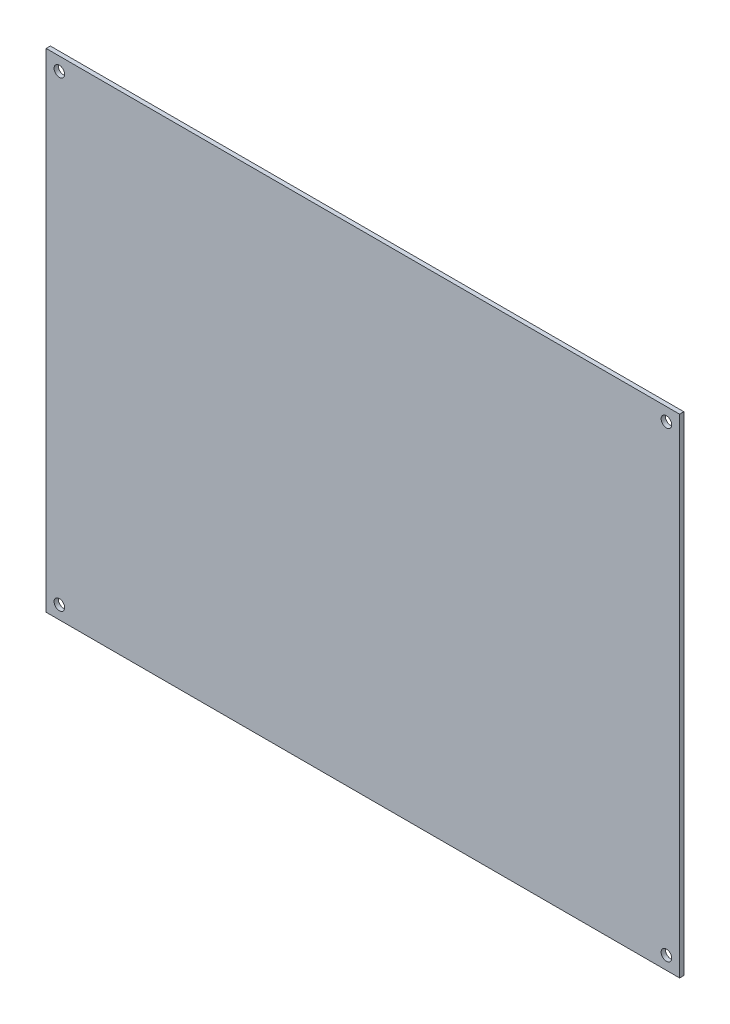
ISO-10303-21;
HEADER;
FILE_DESCRIPTION(('STEP AP214'),'2;1');
FILE_NAME('part.step','',(''),(''),'','','');
FILE_SCHEMA(('AUTOMOTIVE_DESIGN { 1 0 10303 214 1 1 1 1 }'));
ENDSEC;
DATA;
#1=APPLICATION_CONTEXT('core data for automotive mechanical design processes');
#2=APPLICATION_PROTOCOL_DEFINITION('international standard','automotive_design',2000,#1);
#3=PRODUCT_CONTEXT('',#1,'mechanical');
#4=PRODUCT('Part','Part','',(#3));
#5=PRODUCT_RELATED_PRODUCT_CATEGORY('part','',(#4));
#6=PRODUCT_DEFINITION_FORMATION('','',#4);
#7=PRODUCT_DEFINITION_CONTEXT('part definition',#1,'design');
#8=PRODUCT_DEFINITION('design','',#6,#7);
#9=PRODUCT_DEFINITION_SHAPE('','',#8);
#10=(LENGTH_UNIT() NAMED_UNIT(*) SI_UNIT(.MILLI.,.METRE.));
#11=(NAMED_UNIT(*) PLANE_ANGLE_UNIT() SI_UNIT($,.RADIAN.));
#12=(NAMED_UNIT(*) SI_UNIT($,.STERADIAN.) SOLID_ANGLE_UNIT());
#13=UNCERTAINTY_MEASURE_WITH_UNIT(LENGTH_MEASURE(1.E-05),#10,'distance_accuracy_value','');
#14=(GEOMETRIC_REPRESENTATION_CONTEXT(3) GLOBAL_UNCERTAINTY_ASSIGNED_CONTEXT((#13)) GLOBAL_UNIT_ASSIGNED_CONTEXT((#10,
#11,#12)) REPRESENTATION_CONTEXT('',''));
#15=CARTESIAN_POINT('',(0.,0.,0.));
#16=DIRECTION('',(0.,0.,1.));
#17=DIRECTION('',(1.,0.,0.));
#18=AXIS2_PLACEMENT_3D('',#15,#16,#17);
#19=CARTESIAN_POINT('',(0.,0.,1.6));
#20=DIRECTION('',(0.,0.,-1.));
#21=DIRECTION('',(-1.,0.,0.));
#22=AXIS2_PLACEMENT_3D('',#19,#20,#21);
#23=PLANE('',#22);
#24=DIRECTION('',(0.,1.,0.));
#25=VECTOR('',#24,1.);
#26=CARTESIAN_POINT('',(120.,-92.5,1.6));
#27=LINE('',#26,#25);
#28=CARTESIAN_POINT('',(120.,-92.5,1.6));
#29=VERTEX_POINT('',#28);
#30=CARTESIAN_POINT('',(120.,92.5,1.6));
#31=VERTEX_POINT('',#30);
#32=EDGE_CURVE('E85',#29,#31,#27,.T.);
#33=ORIENTED_EDGE('',*,*,#32,.T.);
#34=DIRECTION('',(-1.,0.,0.));
#35=VECTOR('',#34,1.);
#36=CARTESIAN_POINT('',(-120.,92.5,1.6));
#37=LINE('',#36,#35);
#38=CARTESIAN_POINT('',(-120.,92.5,1.6));
#39=VERTEX_POINT('',#38);
#40=EDGE_CURVE('E80',#31,#39,#37,.T.);
#41=ORIENTED_EDGE('',*,*,#40,.T.);
#42=DIRECTION('',(0.,-1.,0.));
#43=VECTOR('',#42,1.);
#44=CARTESIAN_POINT('',(-120.,-92.5,1.6));
#45=LINE('',#44,#43);
#46=CARTESIAN_POINT('',(-120.,-92.5,1.6));
#47=VERTEX_POINT('',#46);
#48=EDGE_CURVE('E83',#39,#47,#45,.T.);
#49=ORIENTED_EDGE('',*,*,#48,.T.);
#50=DIRECTION('',(1.,0.,0.));
#51=VECTOR('',#50,1.);
#52=CARTESIAN_POINT('',(-120.,-92.5,1.6));
#53=LINE('',#52,#51);
#54=EDGE_CURVE('E50',#47,#29,#53,.T.);
#55=ORIENTED_EDGE('',*,*,#54,.T.);
#56=EDGE_LOOP('',(#33,#41,#49,#55));
#57=FACE_BOUND('',#56,.T.);
#58=CARTESIAN_POINT('',(115.,87.5,1.6));
#59=DIRECTION('',(0.,0.,1.));
#60=DIRECTION('',(1.,0.,0.));
#61=AXIS2_PLACEMENT_3D('',#58,#59,#60);
#62=CIRCLE('',#61,2.);
#63=CARTESIAN_POINT('',(117.,87.5,1.6));
#64=VERTEX_POINT('',#63);
#65=EDGE_CURVE('E100',#64,#64,#62,.T.);
#66=ORIENTED_EDGE('',*,*,#65,.F.);
#67=EDGE_LOOP('',(#66));
#68=FACE_BOUND('',#67,.T.);
#69=CARTESIAN_POINT('',(115.,-87.5,1.6));
#70=DIRECTION('',(0.,0.,1.));
#71=DIRECTION('',(-1.,0.,0.));
#72=AXIS2_PLACEMENT_3D('',#69,#70,#71);
#73=CIRCLE('',#72,2.);
#74=CARTESIAN_POINT('',(113.,-87.5,1.6));
#75=VERTEX_POINT('',#74);
#76=EDGE_CURVE('E115',#75,#75,#73,.T.);
#77=ORIENTED_EDGE('',*,*,#76,.F.);
#78=EDGE_LOOP('',(#77));
#79=FACE_BOUND('',#78,.T.);
#80=CARTESIAN_POINT('',(-115.,-87.5,1.6));
#81=DIRECTION('',(0.,0.,1.));
#82=DIRECTION('',(1.,0.,0.));
#83=AXIS2_PLACEMENT_3D('',#80,#81,#82);
#84=CIRCLE('',#83,2.);
#85=CARTESIAN_POINT('',(-113.,-87.5,1.6));
#86=VERTEX_POINT('',#85);
#87=EDGE_CURVE('E121',#86,#86,#84,.T.);
#88=ORIENTED_EDGE('',*,*,#87,.F.);
#89=EDGE_LOOP('',(#88));
#90=FACE_BOUND('',#89,.T.);
#91=CARTESIAN_POINT('',(-115.,87.5,1.6));
#92=DIRECTION('',(0.,0.,1.));
#93=DIRECTION('',(-1.,0.,0.));
#94=AXIS2_PLACEMENT_3D('',#91,#92,#93);
#95=CIRCLE('',#94,2.);
#96=CARTESIAN_POINT('',(-117.,87.5,1.6));
#97=VERTEX_POINT('',#96);
#98=EDGE_CURVE('E127',#97,#97,#95,.T.);
#99=ORIENTED_EDGE('',*,*,#98,.F.);
#100=EDGE_LOOP('',(#99));
#101=FACE_BOUND('',#100,.T.);
#102=ADVANCED_FACE('F33',(#57,#68,#79,#90,#101),#23,.F.);
#103=CARTESIAN_POINT('',(0.,0.,0.));
#104=DIRECTION('',(0.,0.,-1.));
#105=DIRECTION('',(-1.,0.,0.));
#106=AXIS2_PLACEMENT_3D('',#103,#104,#105);
#107=PLANE('',#106);
#108=CARTESIAN_POINT('',(-115.,-87.5,0.));
#109=DIRECTION('',(0.,0.,1.));
#110=DIRECTION('',(1.,0.,0.));
#111=AXIS2_PLACEMENT_3D('',#108,#109,#110);
#112=CIRCLE('',#111,2.);
#113=CARTESIAN_POINT('',(-113.,-87.5,0.));
#114=VERTEX_POINT('',#113);
#115=EDGE_CURVE('E124',#114,#114,#112,.T.);
#116=ORIENTED_EDGE('',*,*,#115,.T.);
#117=EDGE_LOOP('',(#116));
#118=FACE_BOUND('',#117,.T.);
#119=CARTESIAN_POINT('',(115.,87.5,0.));
#120=DIRECTION('',(0.,0.,1.));
#121=DIRECTION('',(1.,0.,0.));
#122=AXIS2_PLACEMENT_3D('',#119,#120,#121);
#123=CIRCLE('',#122,2.);
#124=CARTESIAN_POINT('',(117.,87.5,0.));
#125=VERTEX_POINT('',#124);
#126=EDGE_CURVE('E112',#125,#125,#123,.T.);
#127=ORIENTED_EDGE('',*,*,#126,.T.);
#128=EDGE_LOOP('',(#127));
#129=FACE_BOUND('',#128,.T.);
#130=DIRECTION('',(0.,1.,0.));
#131=VECTOR('',#130,1.);
#132=CARTESIAN_POINT('',(120.,-92.5,0.));
#133=LINE('',#132,#131);
#134=CARTESIAN_POINT('',(120.,-92.5,0.));
#135=VERTEX_POINT('',#134);
#136=CARTESIAN_POINT('',(120.,92.5,0.));
#137=VERTEX_POINT('',#136);
#138=EDGE_CURVE('E97',#135,#137,#133,.T.);
#139=ORIENTED_EDGE('',*,*,#138,.F.);
#140=DIRECTION('',(1.,0.,0.));
#141=VECTOR('',#140,1.);
#142=CARTESIAN_POINT('',(-120.,-92.5,0.));
#143=LINE('',#142,#141);
#144=CARTESIAN_POINT('',(-120.,-92.5,0.));
#145=VERTEX_POINT('',#144);
#146=EDGE_CURVE('E73',#145,#135,#143,.T.);
#147=ORIENTED_EDGE('',*,*,#146,.F.);
#148=DIRECTION('',(0.,-1.,0.));
#149=VECTOR('',#148,1.);
#150=CARTESIAN_POINT('',(-120.,-92.5,0.));
#151=LINE('',#150,#149);
#152=CARTESIAN_POINT('',(-120.,92.5,0.));
#153=VERTEX_POINT('',#152);
#154=EDGE_CURVE('E67',#153,#145,#151,.T.);
#155=ORIENTED_EDGE('',*,*,#154,.F.);
#156=DIRECTION('',(-1.,0.,0.));
#157=VECTOR('',#156,1.);
#158=CARTESIAN_POINT('',(-120.,92.5,0.));
#159=LINE('',#158,#157);
#160=EDGE_CURVE('E89',#137,#153,#159,.T.);
#161=ORIENTED_EDGE('',*,*,#160,.F.);
#162=EDGE_LOOP('',(#139,#147,#155,#161));
#163=FACE_BOUND('',#162,.T.);
#164=CARTESIAN_POINT('',(115.,-87.5,0.));
#165=DIRECTION('',(0.,0.,1.));
#166=DIRECTION('',(-1.,0.,0.));
#167=AXIS2_PLACEMENT_3D('',#164,#165,#166);
#168=CIRCLE('',#167,2.);
#169=CARTESIAN_POINT('',(113.,-87.5,0.));
#170=VERTEX_POINT('',#169);
#171=EDGE_CURVE('E118',#170,#170,#168,.T.);
#172=ORIENTED_EDGE('',*,*,#171,.T.);
#173=EDGE_LOOP('',(#172));
#174=FACE_BOUND('',#173,.T.);
#175=CARTESIAN_POINT('',(-115.,87.5,0.));
#176=DIRECTION('',(0.,0.,1.));
#177=DIRECTION('',(-1.,0.,0.));
#178=AXIS2_PLACEMENT_3D('',#175,#176,#177);
#179=CIRCLE('',#178,2.);
#180=CARTESIAN_POINT('',(-117.,87.5,0.));
#181=VERTEX_POINT('',#180);
#182=EDGE_CURVE('E130',#181,#181,#179,.T.);
#183=ORIENTED_EDGE('',*,*,#182,.T.);
#184=EDGE_LOOP('',(#183));
#185=FACE_BOUND('',#184,.T.);
#186=ADVANCED_FACE('F108',(#118,#129,#163,#174,#185),#107,.T.);
#187=CARTESIAN_POINT('',(120.,-92.5,1.6));
#188=DIRECTION('',(-1.,0.,0.));
#189=DIRECTION('',(0.,0.,1.));
#190=AXIS2_PLACEMENT_3D('',#187,#188,#189);
#191=PLANE('',#190);
#192=ORIENTED_EDGE('',*,*,#138,.T.);
#193=DIRECTION('',(0.,0.,-1.));
#194=VECTOR('',#193,1.);
#195=CARTESIAN_POINT('',(120.,92.5,1.6));
#196=LINE('',#195,#194);
#197=EDGE_CURVE('E11',#31,#137,#196,.T.);
#198=ORIENTED_EDGE('',*,*,#197,.F.);
#199=ORIENTED_EDGE('',*,*,#32,.F.);
#200=DIRECTION('',(0.,0.,-1.));
#201=VECTOR('',#200,1.);
#202=CARTESIAN_POINT('',(120.,-92.5,1.6));
#203=LINE('',#202,#201);
#204=EDGE_CURVE('E93',#29,#135,#203,.T.);
#205=ORIENTED_EDGE('',*,*,#204,.T.);
#206=EDGE_LOOP('',(#192,#198,#199,#205));
#207=FACE_BOUND('',#206,.T.);
#208=ADVANCED_FACE('F35',(#207),#191,.F.);
#209=CARTESIAN_POINT('',(-120.,92.5,1.6));
#210=DIRECTION('',(0.,-1.,0.));
#211=DIRECTION('',(0.,0.,-1.));
#212=AXIS2_PLACEMENT_3D('',#209,#210,#211);
#213=PLANE('',#212);
#214=ORIENTED_EDGE('',*,*,#160,.T.);
#215=DIRECTION('',(0.,0.,-1.));
#216=VECTOR('',#215,1.);
#217=CARTESIAN_POINT('',(-120.,92.5,1.6));
#218=LINE('',#217,#216);
#219=EDGE_CURVE('E42',#39,#153,#218,.T.);
#220=ORIENTED_EDGE('',*,*,#219,.F.);
#221=ORIENTED_EDGE('',*,*,#40,.F.);
#222=ORIENTED_EDGE('',*,*,#197,.T.);
#223=EDGE_LOOP('',(#214,#220,#221,#222));
#224=FACE_BOUND('',#223,.T.);
#225=ADVANCED_FACE('F88',(#224),#213,.F.);
#226=CARTESIAN_POINT('',(-120.,-92.5,1.6));
#227=DIRECTION('',(1.,0.,0.));
#228=DIRECTION('',(0.,0.,-1.));
#229=AXIS2_PLACEMENT_3D('',#226,#227,#228);
#230=PLANE('',#229);
#231=ORIENTED_EDGE('',*,*,#154,.T.);
#232=DIRECTION('',(0.,0.,-1.));
#233=VECTOR('',#232,1.);
#234=CARTESIAN_POINT('',(-120.,-92.5,1.6));
#235=LINE('',#234,#233);
#236=EDGE_CURVE('E90',#47,#145,#235,.T.);
#237=ORIENTED_EDGE('',*,*,#236,.F.);
#238=ORIENTED_EDGE('',*,*,#48,.F.);
#239=ORIENTED_EDGE('',*,*,#219,.T.);
#240=EDGE_LOOP('',(#231,#237,#238,#239));
#241=FACE_BOUND('',#240,.T.);
#242=ADVANCED_FACE('F91',(#241),#230,.F.);
#243=CARTESIAN_POINT('',(-120.,-92.5,1.6));
#244=DIRECTION('',(0.,1.,0.));
#245=DIRECTION('',(0.,0.,1.));
#246=AXIS2_PLACEMENT_3D('',#243,#244,#245);
#247=PLANE('',#246);
#248=ORIENTED_EDGE('',*,*,#146,.T.);
#249=ORIENTED_EDGE('',*,*,#204,.F.);
#250=ORIENTED_EDGE('',*,*,#54,.F.);
#251=ORIENTED_EDGE('',*,*,#236,.T.);
#252=EDGE_LOOP('',(#248,#249,#250,#251));
#253=FACE_BOUND('',#252,.T.);
#254=ADVANCED_FACE('F105',(#253),#247,.F.);
#255=CARTESIAN_POINT('',(115.,87.5,1.6));
#256=DIRECTION('',(0.,0.,-1.));
#257=DIRECTION('',(-1.,0.,0.));
#258=AXIS2_PLACEMENT_3D('',#255,#256,#257);
#259=CYLINDRICAL_SURFACE('',#258,2.);
#260=ORIENTED_EDGE('',*,*,#65,.T.);
#261=EDGE_LOOP('',(#260));
#262=FACE_BOUND('',#261,.T.);
#263=ORIENTED_EDGE('',*,*,#126,.F.);
#264=EDGE_LOOP('',(#263));
#265=FACE_BOUND('',#264,.T.);
#266=ADVANCED_FACE('F147',(#262,#265),#259,.F.);
#267=CARTESIAN_POINT('',(115.,-87.5,1.6));
#268=DIRECTION('',(0.,0.,-1.));
#269=DIRECTION('',(-1.,0.,0.));
#270=AXIS2_PLACEMENT_3D('',#267,#268,#269);
#271=CYLINDRICAL_SURFACE('',#270,2.);
#272=ORIENTED_EDGE('',*,*,#76,.T.);
#273=EDGE_LOOP('',(#272));
#274=FACE_BOUND('',#273,.T.);
#275=ORIENTED_EDGE('',*,*,#171,.F.);
#276=EDGE_LOOP('',(#275));
#277=FACE_BOUND('',#276,.T.);
#278=ADVANCED_FACE('F193',(#274,#277),#271,.F.);
#279=CARTESIAN_POINT('',(-115.,-87.5,1.6));
#280=DIRECTION('',(0.,0.,-1.));
#281=DIRECTION('',(-1.,0.,0.));
#282=AXIS2_PLACEMENT_3D('',#279,#280,#281);
#283=CYLINDRICAL_SURFACE('',#282,2.);
#284=ORIENTED_EDGE('',*,*,#87,.T.);
#285=EDGE_LOOP('',(#284));
#286=FACE_BOUND('',#285,.T.);
#287=ORIENTED_EDGE('',*,*,#115,.F.);
#288=EDGE_LOOP('',(#287));
#289=FACE_BOUND('',#288,.T.);
#290=ADVANCED_FACE('F201',(#286,#289),#283,.F.);
#291=CARTESIAN_POINT('',(-115.,87.5,1.6));
#292=DIRECTION('',(0.,0.,-1.));
#293=DIRECTION('',(-1.,0.,0.));
#294=AXIS2_PLACEMENT_3D('',#291,#292,#293);
#295=CYLINDRICAL_SURFACE('',#294,2.);
#296=ORIENTED_EDGE('',*,*,#98,.T.);
#297=EDGE_LOOP('',(#296));
#298=FACE_BOUND('',#297,.T.);
#299=ORIENTED_EDGE('',*,*,#182,.F.);
#300=EDGE_LOOP('',(#299));
#301=FACE_BOUND('',#300,.T.);
#302=ADVANCED_FACE('F136',(#298,#301),#295,.F.);
#303=CLOSED_SHELL('',(#102,#186,#208,#225,#242,#254,#266,#278,#290,#302));
#304=MANIFOLD_SOLID_BREP('B2',#303);
#305=ADVANCED_BREP_SHAPE_REPRESENTATION('',(#18,#304),#14);
#306=SHAPE_DEFINITION_REPRESENTATION(#9,#305);
ENDSEC;
END-ISO-10303-21;
